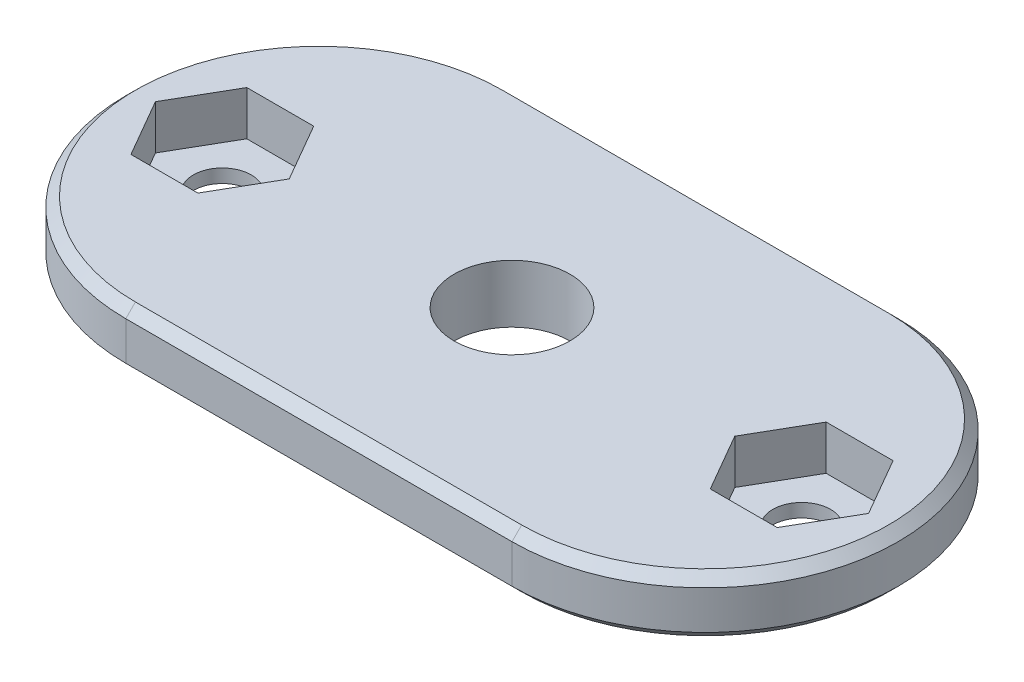
ISO-10303-21;
HEADER;
FILE_DESCRIPTION(('STEP AP214'),'2;1');
FILE_NAME('part.step','',(''),(''),'','','');
FILE_SCHEMA(('AUTOMOTIVE_DESIGN { 1 0 10303 214 1 1 1 1 }'));
ENDSEC;
DATA;
#1=APPLICATION_CONTEXT('core data for automotive mechanical design processes');
#2=APPLICATION_PROTOCOL_DEFINITION('international standard','automotive_design',2000,#1);
#3=PRODUCT_CONTEXT('',#1,'mechanical');
#4=PRODUCT('Part','Part','',(#3));
#5=PRODUCT_RELATED_PRODUCT_CATEGORY('part','',(#4));
#6=PRODUCT_DEFINITION_FORMATION('','',#4);
#7=PRODUCT_DEFINITION_CONTEXT('part definition',#1,'design');
#8=PRODUCT_DEFINITION('design','',#6,#7);
#9=PRODUCT_DEFINITION_SHAPE('','',#8);
#10=(LENGTH_UNIT() NAMED_UNIT(*) SI_UNIT(.MILLI.,.METRE.));
#11=(NAMED_UNIT(*) PLANE_ANGLE_UNIT() SI_UNIT($,.RADIAN.));
#12=(NAMED_UNIT(*) SI_UNIT($,.STERADIAN.) SOLID_ANGLE_UNIT());
#13=UNCERTAINTY_MEASURE_WITH_UNIT(LENGTH_MEASURE(1.E-05),#10,'distance_accuracy_value','');
#14=(GEOMETRIC_REPRESENTATION_CONTEXT(3) GLOBAL_UNCERTAINTY_ASSIGNED_CONTEXT((#13)) GLOBAL_UNIT_ASSIGNED_CONTEXT((#10,
#11,#12)) REPRESENTATION_CONTEXT('',''));
#15=CARTESIAN_POINT('',(0.,0.,0.));
#16=DIRECTION('',(0.,0.,1.));
#17=DIRECTION('',(1.,0.,0.));
#18=AXIS2_PLACEMENT_3D('',#15,#16,#17);
#19=CARTESIAN_POINT('',(25.,3.,0.));
#20=DIRECTION('',(0.,1.,0.));
#21=DIRECTION('',(0.,0.,1.));
#22=AXIS2_PLACEMENT_3D('',#19,#20,#21);
#23=CYLINDRICAL_SURFACE('',#22,1.49999999999999);
#24=CARTESIAN_POINT('',(25.,0.,0.));
#25=DIRECTION('',(0.,1.,0.));
#26=DIRECTION('',(0.,0.,1.));
#27=AXIS2_PLACEMENT_3D('',#24,#25,#26);
#28=CIRCLE('',#27,1.49999999999999);
#29=CARTESIAN_POINT('',(25.,0.,1.49999999999999));
#30=VERTEX_POINT('',#29);
#31=EDGE_CURVE('E287',#30,#30,#28,.T.);
#32=ORIENTED_EDGE('',*,*,#31,.F.);
#33=EDGE_LOOP('',(#32));
#34=FACE_BOUND('',#33,.T.);
#35=CARTESIAN_POINT('',(25.,0.7,0.));
#36=DIRECTION('',(0.,1.,0.));
#37=DIRECTION('',(0.,0.,1.));
#38=AXIS2_PLACEMENT_3D('',#35,#36,#37);
#39=CIRCLE('',#38,1.49999999999999);
#40=CARTESIAN_POINT('',(25.,0.7,1.49999999999999));
#41=VERTEX_POINT('',#40);
#42=EDGE_CURVE('E40',#41,#41,#39,.F.);
#43=ORIENTED_EDGE('',*,*,#42,.F.);
#44=EDGE_LOOP('',(#43));
#45=FACE_BOUND('',#44,.T.);
#46=ADVANCED_FACE('F35',(#34,#45),#23,.F.);
#47=CARTESIAN_POINT('',(-5.,3.,0.));
#48=DIRECTION('',(0.,1.,0.));
#49=DIRECTION('',(0.,0.,1.));
#50=AXIS2_PLACEMENT_3D('',#47,#48,#49);
#51=CYLINDRICAL_SURFACE('',#50,1.49999999999999);
#52=CARTESIAN_POINT('',(-5.,0.,0.));
#53=DIRECTION('',(0.,1.,0.));
#54=DIRECTION('',(0.,0.,1.));
#55=AXIS2_PLACEMENT_3D('',#52,#53,#54);
#56=CIRCLE('',#55,1.49999999999999);
#57=CARTESIAN_POINT('',(-5.,0.,1.49999999999999));
#58=VERTEX_POINT('',#57);
#59=EDGE_CURVE('E284',#58,#58,#56,.T.);
#60=ORIENTED_EDGE('',*,*,#59,.F.);
#61=EDGE_LOOP('',(#60));
#62=FACE_BOUND('',#61,.T.);
#63=CARTESIAN_POINT('',(-5.,0.7,0.));
#64=DIRECTION('',(0.,1.,0.));
#65=DIRECTION('',(0.,0.,1.));
#66=AXIS2_PLACEMENT_3D('',#63,#64,#65);
#67=CIRCLE('',#66,1.49999999999999);
#68=CARTESIAN_POINT('',(-5.,0.7,1.49999999999999));
#69=VERTEX_POINT('',#68);
#70=EDGE_CURVE('E224',#69,#69,#67,.F.);
#71=ORIENTED_EDGE('',*,*,#70,.F.);
#72=EDGE_LOOP('',(#71));
#73=FACE_BOUND('',#72,.T.);
#74=ADVANCED_FACE('F360',(#62,#73),#51,.F.);
#75=CARTESIAN_POINT('',(0.,3.,0.));
#76=DIRECTION('',(0.,-1.,0.));
#77=DIRECTION('',(0.,0.,-1.));
#78=AXIS2_PLACEMENT_3D('',#75,#76,#77);
#79=CYLINDRICAL_SURFACE('',#78,10.);
#80=DIRECTION('',(0.,-1.,0.));
#81=VECTOR('',#80,1.);
#82=CARTESIAN_POINT('',(0.,3.,10.));
#83=LINE('',#82,#81);
#84=CARTESIAN_POINT('',(0.,2.5,10.));
#85=VERTEX_POINT('',#84);
#86=CARTESIAN_POINT('',(0.,0.499999999999994,10.));
#87=VERTEX_POINT('',#86);
#88=EDGE_CURVE('E300',#85,#87,#83,.T.);
#89=ORIENTED_EDGE('',*,*,#88,.F.);
#90=CARTESIAN_POINT('',(0.,2.5,0.));
#91=DIRECTION('',(0.,1.,0.));
#92=DIRECTION('',(0.,0.,1.));
#93=AXIS2_PLACEMENT_3D('',#90,#91,#92);
#94=CIRCLE('',#93,10.);
#95=CARTESIAN_POINT('',(0.,2.5,-10.));
#96=VERTEX_POINT('',#95);
#97=EDGE_CURVE('E328',#85,#96,#94,.F.);
#98=ORIENTED_EDGE('',*,*,#97,.T.);
#99=DIRECTION('',(0.,-1.,0.));
#100=VECTOR('',#99,1.);
#101=CARTESIAN_POINT('',(0.,3.,-10.));
#102=LINE('',#101,#100);
#103=CARTESIAN_POINT('',(0.,0.499999999999994,-10.));
#104=VERTEX_POINT('',#103);
#105=EDGE_CURVE('E291',#96,#104,#102,.T.);
#106=ORIENTED_EDGE('',*,*,#105,.T.);
#107=CARTESIAN_POINT('',(0.,0.499999999999994,0.));
#108=DIRECTION('',(0.,1.,0.));
#109=DIRECTION('',(0.,0.,1.));
#110=AXIS2_PLACEMENT_3D('',#107,#108,#109);
#111=CIRCLE('',#110,10.);
#112=EDGE_CURVE('E326',#104,#87,#111,.T.);
#113=ORIENTED_EDGE('',*,*,#112,.T.);
#114=EDGE_LOOP('',(#89,#98,#106,#113));
#115=FACE_BOUND('',#114,.T.);
#116=ADVANCED_FACE('F366',(#115),#79,.T.);
#117=CARTESIAN_POINT('',(0.,3.,10.));
#118=DIRECTION('',(0.,0.,-1.));
#119=DIRECTION('',(-1.,0.,0.));
#120=AXIS2_PLACEMENT_3D('',#117,#118,#119);
#121=PLANE('',#120);
#122=DIRECTION('',(0.,-1.,0.));
#123=VECTOR('',#122,1.);
#124=CARTESIAN_POINT('',(20.,3.,10.));
#125=LINE('',#124,#123);
#126=CARTESIAN_POINT('',(20.,2.5,10.));
#127=VERTEX_POINT('',#126);
#128=CARTESIAN_POINT('',(20.,0.499999999999994,10.));
#129=VERTEX_POINT('',#128);
#130=EDGE_CURVE('E297',#127,#129,#125,.T.);
#131=ORIENTED_EDGE('',*,*,#130,.F.);
#132=DIRECTION('',(-1.,0.,0.));
#133=VECTOR('',#132,1.);
#134=CARTESIAN_POINT('',(0.,2.5,10.));
#135=LINE('',#134,#133);
#136=EDGE_CURVE('E324',#127,#85,#135,.T.);
#137=ORIENTED_EDGE('',*,*,#136,.T.);
#138=ORIENTED_EDGE('',*,*,#88,.T.);
#139=DIRECTION('',(1.,0.,0.));
#140=VECTOR('',#139,1.);
#141=CARTESIAN_POINT('',(0.,0.499999999999994,10.));
#142=LINE('',#141,#140);
#143=EDGE_CURVE('E321',#87,#129,#142,.T.);
#144=ORIENTED_EDGE('',*,*,#143,.T.);
#145=EDGE_LOOP('',(#131,#137,#138,#144));
#146=FACE_BOUND('',#145,.T.);
#147=ADVANCED_FACE('F388',(#146),#121,.F.);
#148=CARTESIAN_POINT('',(20.,3.,0.));
#149=DIRECTION('',(0.,-1.,0.));
#150=DIRECTION('',(0.,0.,-1.));
#151=AXIS2_PLACEMENT_3D('',#148,#149,#150);
#152=CYLINDRICAL_SURFACE('',#151,10.);
#153=DIRECTION('',(0.,-1.,0.));
#154=VECTOR('',#153,1.);
#155=CARTESIAN_POINT('',(20.,3.,-10.));
#156=LINE('',#155,#154);
#157=CARTESIAN_POINT('',(20.,2.5,-10.));
#158=VERTEX_POINT('',#157);
#159=CARTESIAN_POINT('',(20.,0.499999999999994,-10.));
#160=VERTEX_POINT('',#159);
#161=EDGE_CURVE('E294',#158,#160,#156,.T.);
#162=ORIENTED_EDGE('',*,*,#161,.F.);
#163=CARTESIAN_POINT('',(20.,2.5,0.));
#164=DIRECTION('',(0.,1.,0.));
#165=DIRECTION('',(0.,0.,1.));
#166=AXIS2_PLACEMENT_3D('',#163,#164,#165);
#167=CIRCLE('',#166,10.);
#168=EDGE_CURVE('E319',#158,#127,#167,.F.);
#169=ORIENTED_EDGE('',*,*,#168,.T.);
#170=ORIENTED_EDGE('',*,*,#130,.T.);
#171=CARTESIAN_POINT('',(20.,0.499999999999994,0.));
#172=DIRECTION('',(0.,1.,0.));
#173=DIRECTION('',(0.,0.,1.));
#174=AXIS2_PLACEMENT_3D('',#171,#172,#173);
#175=CIRCLE('',#174,10.);
#176=EDGE_CURVE('E317',#129,#160,#175,.T.);
#177=ORIENTED_EDGE('',*,*,#176,.T.);
#178=EDGE_LOOP('',(#162,#169,#170,#177));
#179=FACE_BOUND('',#178,.T.);
#180=ADVANCED_FACE('F384',(#179),#152,.T.);
#181=CARTESIAN_POINT('',(0.,3.,-10.));
#182=DIRECTION('',(0.,0.,1.));
#183=DIRECTION('',(1.,0.,0.));
#184=AXIS2_PLACEMENT_3D('',#181,#182,#183);
#185=PLANE('',#184);
#186=ORIENTED_EDGE('',*,*,#105,.F.);
#187=DIRECTION('',(1.,0.,0.));
#188=VECTOR('',#187,1.);
#189=CARTESIAN_POINT('',(20.,2.5,-10.));
#190=LINE('',#189,#188);
#191=EDGE_CURVE('E314',#96,#158,#190,.T.);
#192=ORIENTED_EDGE('',*,*,#191,.T.);
#193=ORIENTED_EDGE('',*,*,#161,.T.);
#194=DIRECTION('',(-1.,0.,0.));
#195=VECTOR('',#194,1.);
#196=CARTESIAN_POINT('',(0.,0.499999999999994,-10.));
#197=LINE('',#196,#195);
#198=EDGE_CURVE('E312',#160,#104,#197,.T.);
#199=ORIENTED_EDGE('',*,*,#198,.T.);
#200=EDGE_LOOP('',(#186,#192,#193,#199));
#201=FACE_BOUND('',#200,.T.);
#202=ADVANCED_FACE('F376',(#201),#185,.F.);
#203=CARTESIAN_POINT('',(0.,3.,0.));
#204=DIRECTION('',(0.,1.,0.));
#205=DIRECTION('',(0.,0.,1.));
#206=AXIS2_PLACEMENT_3D('',#203,#204,#205);
#207=PLANE('',#206);
#208=DIRECTION('',(0.5,0.,-0.866025403784439));
#209=VECTOR('',#208,1.);
#210=CARTESIAN_POINT('',(-3.26794919243112,3.,3.));
#211=LINE('',#210,#209);
#212=CARTESIAN_POINT('',(-3.26794919243112,3.,3.));
#213=VERTEX_POINT('',#212);
#214=CARTESIAN_POINT('',(-1.53589838486225,3.,0.));
#215=VERTEX_POINT('',#214);
#216=EDGE_CURVE('E53',#213,#215,#211,.T.);
#217=ORIENTED_EDGE('',*,*,#216,.F.);
#218=DIRECTION('',(1.,0.,0.));
#219=VECTOR('',#218,1.);
#220=CARTESIAN_POINT('',(-6.73205080756888,3.,3.));
#221=LINE('',#220,#219);
#222=CARTESIAN_POINT('',(-6.73205080756888,3.,3.));
#223=VERTEX_POINT('',#222);
#224=EDGE_CURVE('E197',#223,#213,#221,.T.);
#225=ORIENTED_EDGE('',*,*,#224,.F.);
#226=DIRECTION('',(0.5,0.,0.866025403784438));
#227=VECTOR('',#226,1.);
#228=CARTESIAN_POINT('',(-8.46410161513776,3.,0.));
#229=LINE('',#228,#227);
#230=CARTESIAN_POINT('',(-8.46410161513776,3.,0.));
#231=VERTEX_POINT('',#230);
#232=EDGE_CURVE('E200',#231,#223,#229,.T.);
#233=ORIENTED_EDGE('',*,*,#232,.F.);
#234=DIRECTION('',(-0.5,0.,0.866025403784439));
#235=VECTOR('',#234,1.);
#236=CARTESIAN_POINT('',(-6.73205080756888,3.,-3.));
#237=LINE('',#236,#235);
#238=CARTESIAN_POINT('',(-6.73205080756888,3.,-3.));
#239=VERTEX_POINT('',#238);
#240=EDGE_CURVE('E217',#239,#231,#237,.T.);
#241=ORIENTED_EDGE('',*,*,#240,.F.);
#242=DIRECTION('',(-1.,0.,0.));
#243=VECTOR('',#242,1.);
#244=CARTESIAN_POINT('',(-3.26794919243112,3.,-3.));
#245=LINE('',#244,#243);
#246=CARTESIAN_POINT('',(-3.26794919243112,3.,-3.));
#247=VERTEX_POINT('',#246);
#248=EDGE_CURVE('E214',#247,#239,#245,.T.);
#249=ORIENTED_EDGE('',*,*,#248,.F.);
#250=DIRECTION('',(-0.5,0.,-0.866025403784439));
#251=VECTOR('',#250,1.);
#252=CARTESIAN_POINT('',(-1.53589838486225,3.,0.));
#253=LINE('',#252,#251);
#254=EDGE_CURVE('E211',#215,#247,#253,.T.);
#255=ORIENTED_EDGE('',*,*,#254,.F.);
#256=EDGE_LOOP('',(#217,#225,#233,#241,#249,#255));
#257=FACE_BOUND('',#256,.T.);
#258=DIRECTION('',(-0.5,0.,0.866025403784438));
#259=VECTOR('',#258,1.);
#260=CARTESIAN_POINT('',(23.2679491924311,3.,-2.99999999999999));
#261=LINE('',#260,#259);
#262=CARTESIAN_POINT('',(23.2679491924311,3.,-2.99999999999999));
#263=VERTEX_POINT('',#262);
#264=CARTESIAN_POINT('',(21.5358983848623,3.,0.));
#265=VERTEX_POINT('',#264);
#266=EDGE_CURVE('E61',#263,#265,#261,.T.);
#267=ORIENTED_EDGE('',*,*,#266,.F.);
#268=DIRECTION('',(-1.,0.,0.));
#269=VECTOR('',#268,1.);
#270=CARTESIAN_POINT('',(26.7320508075689,3.,-2.99999999999999));
#271=LINE('',#270,#269);
#272=CARTESIAN_POINT('',(26.7320508075689,3.,-2.99999999999999));
#273=VERTEX_POINT('',#272);
#274=EDGE_CURVE('E236',#273,#263,#271,.T.);
#275=ORIENTED_EDGE('',*,*,#274,.F.);
#276=DIRECTION('',(-0.5,0.,-0.866025403784439));
#277=VECTOR('',#276,1.);
#278=CARTESIAN_POINT('',(28.4641016151378,3.,0.));
#279=LINE('',#278,#277);
#280=CARTESIAN_POINT('',(28.4641016151378,3.,0.));
#281=VERTEX_POINT('',#280);
#282=EDGE_CURVE('E262',#281,#273,#279,.T.);
#283=ORIENTED_EDGE('',*,*,#282,.F.);
#284=DIRECTION('',(0.5,0.,-0.866025403784438));
#285=VECTOR('',#284,1.);
#286=CARTESIAN_POINT('',(26.7320508075689,3.,3.));
#287=LINE('',#286,#285);
#288=CARTESIAN_POINT('',(26.7320508075689,3.,3.));
#289=VERTEX_POINT('',#288);
#290=EDGE_CURVE('E259',#289,#281,#287,.T.);
#291=ORIENTED_EDGE('',*,*,#290,.F.);
#292=DIRECTION('',(1.,0.,0.));
#293=VECTOR('',#292,1.);
#294=CARTESIAN_POINT('',(23.2679491924311,3.,3.));
#295=LINE('',#294,#293);
#296=CARTESIAN_POINT('',(23.2679491924311,3.,3.));
#297=VERTEX_POINT('',#296);
#298=EDGE_CURVE('E256',#297,#289,#295,.T.);
#299=ORIENTED_EDGE('',*,*,#298,.F.);
#300=DIRECTION('',(0.5,0.,0.866025403784439));
#301=VECTOR('',#300,1.);
#302=CARTESIAN_POINT('',(21.5358983848623,3.,0.));
#303=LINE('',#302,#301);
#304=EDGE_CURVE('E253',#265,#297,#303,.T.);
#305=ORIENTED_EDGE('',*,*,#304,.F.);
#306=EDGE_LOOP('',(#267,#275,#283,#291,#299,#305));
#307=FACE_BOUND('',#306,.T.);
#308=CARTESIAN_POINT('',(10.,3.,0.));
#309=DIRECTION('',(0.,1.,0.));
#310=DIRECTION('',(0.,0.,1.));
#311=AXIS2_PLACEMENT_3D('',#308,#309,#310);
#312=CIRCLE('',#311,3.);
#313=CARTESIAN_POINT('',(10.,3.,3.));
#314=VERTEX_POINT('',#313);
#315=EDGE_CURVE('E281',#314,#314,#312,.T.);
#316=ORIENTED_EDGE('',*,*,#315,.F.);
#317=EDGE_LOOP('',(#316));
#318=FACE_BOUND('',#317,.T.);
#319=CARTESIAN_POINT('',(20.,3.,0.));
#320=DIRECTION('',(0.,1.,0.));
#321=DIRECTION('',(0.,0.,1.));
#322=AXIS2_PLACEMENT_3D('',#319,#320,#321);
#323=CIRCLE('',#322,9.50000000000001);
#324=CARTESIAN_POINT('',(20.,3.,9.50000000000001));
#325=VERTEX_POINT('',#324);
#326=CARTESIAN_POINT('',(20.,3.,-9.50000000000001));
#327=VERTEX_POINT('',#326);
#328=EDGE_CURVE('E307',#325,#327,#323,.T.);
#329=ORIENTED_EDGE('',*,*,#328,.T.);
#330=DIRECTION('',(-1.,0.,0.));
#331=VECTOR('',#330,1.);
#332=CARTESIAN_POINT('',(0.,3.,-9.50000000000001));
#333=LINE('',#332,#331);
#334=CARTESIAN_POINT('',(0.,3.,-9.50000000000001));
#335=VERTEX_POINT('',#334);
#336=EDGE_CURVE('E309',#327,#335,#333,.T.);
#337=ORIENTED_EDGE('',*,*,#336,.T.);
#338=CARTESIAN_POINT('',(0.,3.,0.));
#339=DIRECTION('',(0.,1.,0.));
#340=DIRECTION('',(0.,0.,1.));
#341=AXIS2_PLACEMENT_3D('',#338,#339,#340);
#342=CIRCLE('',#341,9.50000000000001);
#343=CARTESIAN_POINT('',(0.,3.,9.50000000000001));
#344=VERTEX_POINT('',#343);
#345=EDGE_CURVE('E303',#335,#344,#342,.T.);
#346=ORIENTED_EDGE('',*,*,#345,.T.);
#347=DIRECTION('',(1.,0.,0.));
#348=VECTOR('',#347,1.);
#349=CARTESIAN_POINT('',(20.,3.,9.50000000000001));
#350=LINE('',#349,#348);
#351=EDGE_CURVE('E305',#344,#325,#350,.T.);
#352=ORIENTED_EDGE('',*,*,#351,.T.);
#353=EDGE_LOOP('',(#329,#337,#346,#352));
#354=FACE_BOUND('',#353,.T.);
#355=ADVANCED_FACE('F372',(#257,#307,#318,#354),#207,.T.);
#356=CARTESIAN_POINT('',(0.,0.,0.));
#357=DIRECTION('',(0.,1.,0.));
#358=DIRECTION('',(0.,0.,1.));
#359=AXIS2_PLACEMENT_3D('',#356,#357,#358);
#360=PLANE('',#359);
#361=CARTESIAN_POINT('',(10.,0.,0.));
#362=DIRECTION('',(0.,1.,0.));
#363=DIRECTION('',(0.,0.,1.));
#364=AXIS2_PLACEMENT_3D('',#361,#362,#363);
#365=CIRCLE('',#364,3.);
#366=CARTESIAN_POINT('',(10.,0.,3.));
#367=VERTEX_POINT('',#366);
#368=EDGE_CURVE('E277',#367,#367,#365,.T.);
#369=ORIENTED_EDGE('',*,*,#368,.T.);
#370=EDGE_LOOP('',(#369));
#371=FACE_BOUND('',#370,.T.);
#372=CARTESIAN_POINT('',(20.,0.,0.));
#373=DIRECTION('',(0.,1.,0.));
#374=DIRECTION('',(0.,0.,1.));
#375=AXIS2_PLACEMENT_3D('',#372,#373,#374);
#376=CIRCLE('',#375,9.50000000000001);
#377=CARTESIAN_POINT('',(20.,0.,-9.50000000000001));
#378=VERTEX_POINT('',#377);
#379=CARTESIAN_POINT('',(20.,0.,9.50000000000001));
#380=VERTEX_POINT('',#379);
#381=EDGE_CURVE('E45',#378,#380,#376,.F.);
#382=ORIENTED_EDGE('',*,*,#381,.T.);
#383=DIRECTION('',(-1.,0.,0.));
#384=VECTOR('',#383,1.);
#385=CARTESIAN_POINT('',(0.,0.,9.50000000000001));
#386=LINE('',#385,#384);
#387=CARTESIAN_POINT('',(0.,0.,9.50000000000001));
#388=VERTEX_POINT('',#387);
#389=EDGE_CURVE('E11',#380,#388,#386,.T.);
#390=ORIENTED_EDGE('',*,*,#389,.T.);
#391=CARTESIAN_POINT('',(0.,0.,0.));
#392=DIRECTION('',(0.,1.,0.));
#393=DIRECTION('',(0.,0.,1.));
#394=AXIS2_PLACEMENT_3D('',#391,#392,#393);
#395=CIRCLE('',#394,9.50000000000001);
#396=CARTESIAN_POINT('',(0.,0.,-9.50000000000001));
#397=VERTEX_POINT('',#396);
#398=EDGE_CURVE('E332',#388,#397,#395,.F.);
#399=ORIENTED_EDGE('',*,*,#398,.T.);
#400=DIRECTION('',(1.,0.,0.));
#401=VECTOR('',#400,1.);
#402=CARTESIAN_POINT('',(0.,0.,-9.50000000000001));
#403=LINE('',#402,#401);
#404=EDGE_CURVE('E330',#397,#378,#403,.T.);
#405=ORIENTED_EDGE('',*,*,#404,.T.);
#406=EDGE_LOOP('',(#382,#390,#399,#405));
#407=FACE_BOUND('',#406,.T.);
#408=ORIENTED_EDGE('',*,*,#59,.T.);
#409=EDGE_LOOP('',(#408));
#410=FACE_BOUND('',#409,.T.);
#411=ORIENTED_EDGE('',*,*,#31,.T.);
#412=EDGE_LOOP('',(#411));
#413=FACE_BOUND('',#412,.T.);
#414=ADVANCED_FACE('F375',(#371,#407,#410,#413),#360,.F.);
#415=CARTESIAN_POINT('',(0.,3.,9.50000000000001));
#416=DIRECTION('',(0.,0.707106781186542,0.707106781186552));
#417=DIRECTION('',(-1.,0.,0.));
#418=AXIS2_PLACEMENT_3D('',#415,#416,#417);
#419=PLANE('',#418);
#420=DIRECTION('',(0.,0.707106781186552,-0.707106781186542));
#421=VECTOR('',#420,1.);
#422=CARTESIAN_POINT('',(0.,2.5,10.));
#423=LINE('',#422,#421);
#424=EDGE_CURVE('E340',#85,#344,#423,.T.);
#425=ORIENTED_EDGE('',*,*,#424,.F.);
#426=ORIENTED_EDGE('',*,*,#136,.F.);
#427=DIRECTION('',(0.,-0.707106781186552,0.707106781186542));
#428=VECTOR('',#427,1.);
#429=CARTESIAN_POINT('',(20.,3.,9.50000000000001));
#430=LINE('',#429,#428);
#431=EDGE_CURVE('E288',#325,#127,#430,.T.);
#432=ORIENTED_EDGE('',*,*,#431,.F.);
#433=ORIENTED_EDGE('',*,*,#351,.F.);
#434=EDGE_LOOP('',(#425,#426,#432,#433));
#435=FACE_BOUND('',#434,.T.);
#436=ADVANCED_FACE('F380',(#435),#419,.T.);
#437=CARTESIAN_POINT('',(20.,3.,0.));
#438=DIRECTION('',(0.,-1.,0.));
#439=DIRECTION('',(0.,0.,-1.));
#440=AXIS2_PLACEMENT_3D('',#437,#438,#439);
#441=CONICAL_SURFACE('',#440,9.50000000000001,0.785398163397441);
#442=ORIENTED_EDGE('',*,*,#431,.T.);
#443=ORIENTED_EDGE('',*,*,#168,.F.);
#444=DIRECTION('',(0.,-0.707106781186552,-0.707106781186542));
#445=VECTOR('',#444,1.);
#446=CARTESIAN_POINT('',(20.,3.,-9.50000000000001));
#447=LINE('',#446,#445);
#448=EDGE_CURVE('E337',#327,#158,#447,.T.);
#449=ORIENTED_EDGE('',*,*,#448,.F.);
#450=ORIENTED_EDGE('',*,*,#328,.F.);
#451=EDGE_LOOP('',(#442,#443,#449,#450));
#452=FACE_BOUND('',#451,.T.);
#453=ADVANCED_FACE('F410',(#452),#441,.T.);
#454=CARTESIAN_POINT('',(0.,3.,0.));
#455=DIRECTION('',(0.,-1.,0.));
#456=DIRECTION('',(0.,0.,-1.));
#457=AXIS2_PLACEMENT_3D('',#454,#455,#456);
#458=CONICAL_SURFACE('',#457,9.50000000000001,0.785398163397441);
#459=ORIENTED_EDGE('',*,*,#424,.T.);
#460=ORIENTED_EDGE('',*,*,#345,.F.);
#461=DIRECTION('',(0.,0.707106781186552,0.707106781186542));
#462=VECTOR('',#461,1.);
#463=CARTESIAN_POINT('',(0.,2.5,-10.));
#464=LINE('',#463,#462);
#465=EDGE_CURVE('E335',#96,#335,#464,.T.);
#466=ORIENTED_EDGE('',*,*,#465,.F.);
#467=ORIENTED_EDGE('',*,*,#97,.F.);
#468=EDGE_LOOP('',(#459,#460,#466,#467));
#469=FACE_BOUND('',#468,.T.);
#470=ADVANCED_FACE('F403',(#469),#458,.T.);
#471=CARTESIAN_POINT('',(0.,3.,-9.50000000000001));
#472=DIRECTION('',(0.,0.707106781186542,-0.707106781186552));
#473=DIRECTION('',(1.,0.,0.));
#474=AXIS2_PLACEMENT_3D('',#471,#472,#473);
#475=PLANE('',#474);
#476=ORIENTED_EDGE('',*,*,#448,.T.);
#477=ORIENTED_EDGE('',*,*,#191,.F.);
#478=ORIENTED_EDGE('',*,*,#465,.T.);
#479=ORIENTED_EDGE('',*,*,#336,.F.);
#480=EDGE_LOOP('',(#476,#477,#478,#479));
#481=FACE_BOUND('',#480,.T.);
#482=ADVANCED_FACE('F397',(#481),#475,.T.);
#483=CARTESIAN_POINT('',(0.,0.499999999999994,-10.));
#484=DIRECTION('',(0.,0.707106781186547,0.707106781186547));
#485=DIRECTION('',(-1.,0.,0.));
#486=AXIS2_PLACEMENT_3D('',#483,#484,#485);
#487=PLANE('',#486);
#488=DIRECTION('',(0.,0.707106781186547,-0.707106781186547));
#489=VECTOR('',#488,1.);
#490=CARTESIAN_POINT('',(20.,0.,-9.50000000000001));
#491=LINE('',#490,#489);
#492=EDGE_CURVE('E348',#378,#160,#491,.T.);
#493=ORIENTED_EDGE('',*,*,#492,.F.);
#494=ORIENTED_EDGE('',*,*,#404,.F.);
#495=DIRECTION('',(0.,-0.707106781186547,0.707106781186547));
#496=VECTOR('',#495,1.);
#497=CARTESIAN_POINT('',(0.,0.499999999999994,-10.));
#498=LINE('',#497,#496);
#499=EDGE_CURVE('E338',#104,#397,#498,.T.);
#500=ORIENTED_EDGE('',*,*,#499,.F.);
#501=ORIENTED_EDGE('',*,*,#198,.F.);
#502=EDGE_LOOP('',(#493,#494,#500,#501));
#503=FACE_BOUND('',#502,.T.);
#504=ADVANCED_FACE('F38',(#503),#487,.F.);
#505=CARTESIAN_POINT('',(0.,0.499999999999994,0.));
#506=DIRECTION('',(0.,1.,0.));
#507=DIRECTION('',(0.,0.,1.));
#508=AXIS2_PLACEMENT_3D('',#505,#506,#507);
#509=CONICAL_SURFACE('',#508,10.,0.785398163397448);
#510=ORIENTED_EDGE('',*,*,#499,.T.);
#511=ORIENTED_EDGE('',*,*,#398,.F.);
#512=DIRECTION('',(0.,-0.707106781186547,-0.707106781186547));
#513=VECTOR('',#512,1.);
#514=CARTESIAN_POINT('',(0.,0.499999999999994,10.));
#515=LINE('',#514,#513);
#516=EDGE_CURVE('E346',#87,#388,#515,.T.);
#517=ORIENTED_EDGE('',*,*,#516,.F.);
#518=ORIENTED_EDGE('',*,*,#112,.F.);
#519=EDGE_LOOP('',(#510,#511,#517,#518));
#520=FACE_BOUND('',#519,.T.);
#521=ADVANCED_FACE('F437',(#520),#509,.T.);
#522=CARTESIAN_POINT('',(20.,0.499999999999994,0.));
#523=DIRECTION('',(0.,1.,0.));
#524=DIRECTION('',(0.,0.,1.));
#525=AXIS2_PLACEMENT_3D('',#522,#523,#524);
#526=CONICAL_SURFACE('',#525,10.,0.785398163397448);
#527=ORIENTED_EDGE('',*,*,#492,.T.);
#528=ORIENTED_EDGE('',*,*,#176,.F.);
#529=DIRECTION('',(0.,0.707106781186547,0.707106781186547));
#530=VECTOR('',#529,1.);
#531=CARTESIAN_POINT('',(20.,0.,9.50000000000001));
#532=LINE('',#531,#530);
#533=EDGE_CURVE('E280',#380,#129,#532,.T.);
#534=ORIENTED_EDGE('',*,*,#533,.F.);
#535=ORIENTED_EDGE('',*,*,#381,.F.);
#536=EDGE_LOOP('',(#527,#528,#534,#535));
#537=FACE_BOUND('',#536,.T.);
#538=ADVANCED_FACE('F431',(#537),#526,.T.);
#539=CARTESIAN_POINT('',(0.,0.499999999999994,10.));
#540=DIRECTION('',(0.,0.707106781186547,-0.707106781186547));
#541=DIRECTION('',(1.,0.,0.));
#542=AXIS2_PLACEMENT_3D('',#539,#540,#541);
#543=PLANE('',#542);
#544=ORIENTED_EDGE('',*,*,#516,.T.);
#545=ORIENTED_EDGE('',*,*,#389,.F.);
#546=ORIENTED_EDGE('',*,*,#533,.T.);
#547=ORIENTED_EDGE('',*,*,#143,.F.);
#548=EDGE_LOOP('',(#544,#545,#546,#547));
#549=FACE_BOUND('',#548,.T.);
#550=ADVANCED_FACE('F424',(#549),#543,.F.);
#551=CARTESIAN_POINT('',(10.,0.,0.));
#552=DIRECTION('',(0.,1.,0.));
#553=DIRECTION('',(0.,0.,1.));
#554=AXIS2_PLACEMENT_3D('',#551,#552,#553);
#555=CYLINDRICAL_SURFACE('',#554,3.);
#556=ORIENTED_EDGE('',*,*,#368,.F.);
#557=EDGE_LOOP('',(#556));
#558=FACE_BOUND('',#557,.T.);
#559=ORIENTED_EDGE('',*,*,#315,.T.);
#560=EDGE_LOOP('',(#559));
#561=FACE_BOUND('',#560,.T.);
#562=ADVANCED_FACE('F430',(#558,#561),#555,.F.);
#563=CARTESIAN_POINT('',(0.,0.7,0.));
#564=DIRECTION('',(0.,1.,0.));
#565=DIRECTION('',(0.,0.,1.));
#566=AXIS2_PLACEMENT_3D('',#563,#564,#565);
#567=PLANE('',#566);
#568=DIRECTION('',(0.5,0.,-0.866025403784439));
#569=VECTOR('',#568,1.);
#570=CARTESIAN_POINT('',(-3.26794919243112,0.7,3.));
#571=LINE('',#570,#569);
#572=CARTESIAN_POINT('',(-3.26794919243112,0.7,3.));
#573=VERTEX_POINT('',#572);
#574=CARTESIAN_POINT('',(-1.53589838486225,0.7,0.));
#575=VERTEX_POINT('',#574);
#576=EDGE_CURVE('E177',#573,#575,#571,.T.);
#577=ORIENTED_EDGE('',*,*,#576,.T.);
#578=DIRECTION('',(-0.5,0.,-0.866025403784439));
#579=VECTOR('',#578,1.);
#580=CARTESIAN_POINT('',(-1.53589838486225,0.7,0.));
#581=LINE('',#580,#579);
#582=CARTESIAN_POINT('',(-3.26794919243112,0.7,-3.));
#583=VERTEX_POINT('',#582);
#584=EDGE_CURVE('E186',#575,#583,#581,.T.);
#585=ORIENTED_EDGE('',*,*,#584,.T.);
#586=DIRECTION('',(-1.,0.,0.));
#587=VECTOR('',#586,1.);
#588=CARTESIAN_POINT('',(-3.26794919243112,0.7,-3.));
#589=LINE('',#588,#587);
#590=CARTESIAN_POINT('',(-6.73205080756888,0.7,-3.));
#591=VERTEX_POINT('',#590);
#592=EDGE_CURVE('E191',#583,#591,#589,.T.);
#593=ORIENTED_EDGE('',*,*,#592,.T.);
#594=DIRECTION('',(-0.5,0.,0.866025403784439));
#595=VECTOR('',#594,1.);
#596=CARTESIAN_POINT('',(-6.73205080756888,0.7,-3.));
#597=LINE('',#596,#595);
#598=CARTESIAN_POINT('',(-8.46410161513776,0.7,0.));
#599=VERTEX_POINT('',#598);
#600=EDGE_CURVE('E204',#591,#599,#597,.T.);
#601=ORIENTED_EDGE('',*,*,#600,.T.);
#602=DIRECTION('',(0.5,0.,0.866025403784438));
#603=VECTOR('',#602,1.);
#604=CARTESIAN_POINT('',(-8.46410161513776,0.7,0.));
#605=LINE('',#604,#603);
#606=CARTESIAN_POINT('',(-6.73205080756888,0.7,3.));
#607=VERTEX_POINT('',#606);
#608=EDGE_CURVE('E207',#599,#607,#605,.T.);
#609=ORIENTED_EDGE('',*,*,#608,.T.);
#610=DIRECTION('',(1.,0.,0.));
#611=VECTOR('',#610,1.);
#612=CARTESIAN_POINT('',(-6.73205080756888,0.7,3.));
#613=LINE('',#612,#611);
#614=EDGE_CURVE('E183',#607,#573,#613,.T.);
#615=ORIENTED_EDGE('',*,*,#614,.T.);
#616=EDGE_LOOP('',(#577,#585,#593,#601,#609,#615));
#617=FACE_BOUND('',#616,.T.);
#618=ORIENTED_EDGE('',*,*,#70,.T.);
#619=EDGE_LOOP('',(#618));
#620=FACE_BOUND('',#619,.T.);
#621=ADVANCED_FACE('F193',(#617,#620),#567,.T.);
#622=CARTESIAN_POINT('',(-3.26794919243112,0.7,3.));
#623=DIRECTION('',(0.866025403784439,0.,0.5));
#624=DIRECTION('',(0.5,0.,-0.866025403784439));
#625=AXIS2_PLACEMENT_3D('',#622,#623,#624);
#626=PLANE('',#625);
#627=ORIENTED_EDGE('',*,*,#216,.T.);
#628=DIRECTION('',(0.,1.,0.));
#629=VECTOR('',#628,1.);
#630=CARTESIAN_POINT('',(-1.53589838486225,0.7,0.));
#631=LINE('',#630,#629);
#632=EDGE_CURVE('E173',#575,#215,#631,.T.);
#633=ORIENTED_EDGE('',*,*,#632,.F.);
#634=ORIENTED_EDGE('',*,*,#576,.F.);
#635=DIRECTION('',(0.,1.,0.));
#636=VECTOR('',#635,1.);
#637=CARTESIAN_POINT('',(-3.26794919243112,0.7,3.));
#638=LINE('',#637,#636);
#639=EDGE_CURVE('E222',#573,#213,#638,.T.);
#640=ORIENTED_EDGE('',*,*,#639,.T.);
#641=EDGE_LOOP('',(#627,#633,#634,#640));
#642=FACE_BOUND('',#641,.T.);
#643=ADVANCED_FACE('F175',(#642),#626,.F.);
#644=CARTESIAN_POINT('',(-6.73205080756888,0.7,3.));
#645=DIRECTION('',(0.,0.,1.));
#646=DIRECTION('',(1.,0.,0.));
#647=AXIS2_PLACEMENT_3D('',#644,#645,#646);
#648=PLANE('',#647);
#649=ORIENTED_EDGE('',*,*,#224,.T.);
#650=ORIENTED_EDGE('',*,*,#639,.F.);
#651=ORIENTED_EDGE('',*,*,#614,.F.);
#652=DIRECTION('',(0.,1.,0.));
#653=VECTOR('',#652,1.);
#654=CARTESIAN_POINT('',(-6.73205080756888,0.7,3.));
#655=LINE('',#654,#653);
#656=EDGE_CURVE('E225',#607,#223,#655,.T.);
#657=ORIENTED_EDGE('',*,*,#656,.T.);
#658=EDGE_LOOP('',(#649,#650,#651,#657));
#659=FACE_BOUND('',#658,.T.);
#660=ADVANCED_FACE('F556',(#659),#648,.F.);
#661=CARTESIAN_POINT('',(-8.46410161513776,0.7,0.));
#662=DIRECTION('',(-0.866025403784438,0.,0.5));
#663=DIRECTION('',(0.5,0.,0.866025403784438));
#664=AXIS2_PLACEMENT_3D('',#661,#662,#663);
#665=PLANE('',#664);
#666=ORIENTED_EDGE('',*,*,#232,.T.);
#667=ORIENTED_EDGE('',*,*,#656,.F.);
#668=ORIENTED_EDGE('',*,*,#608,.F.);
#669=DIRECTION('',(0.,1.,0.));
#670=VECTOR('',#669,1.);
#671=CARTESIAN_POINT('',(-8.46410161513776,0.7,0.));
#672=LINE('',#671,#670);
#673=EDGE_CURVE('E227',#599,#231,#672,.T.);
#674=ORIENTED_EDGE('',*,*,#673,.T.);
#675=EDGE_LOOP('',(#666,#667,#668,#674));
#676=FACE_BOUND('',#675,.T.);
#677=ADVANCED_FACE('F563',(#676),#665,.F.);
#678=CARTESIAN_POINT('',(-6.73205080756888,0.7,-3.));
#679=DIRECTION('',(-0.866025403784439,0.,-0.5));
#680=DIRECTION('',(-0.5,0.,0.866025403784439));
#681=AXIS2_PLACEMENT_3D('',#678,#679,#680);
#682=PLANE('',#681);
#683=ORIENTED_EDGE('',*,*,#240,.T.);
#684=ORIENTED_EDGE('',*,*,#673,.F.);
#685=ORIENTED_EDGE('',*,*,#600,.F.);
#686=DIRECTION('',(0.,1.,0.));
#687=VECTOR('',#686,1.);
#688=CARTESIAN_POINT('',(-6.73205080756888,0.7,-3.));
#689=LINE('',#688,#687);
#690=EDGE_CURVE('E229',#591,#239,#689,.T.);
#691=ORIENTED_EDGE('',*,*,#690,.T.);
#692=EDGE_LOOP('',(#683,#684,#685,#691));
#693=FACE_BOUND('',#692,.T.);
#694=ADVANCED_FACE('F571',(#693),#682,.F.);
#695=CARTESIAN_POINT('',(-3.26794919243112,0.7,-3.));
#696=DIRECTION('',(0.,0.,-1.));
#697=DIRECTION('',(-1.,0.,0.));
#698=AXIS2_PLACEMENT_3D('',#695,#696,#697);
#699=PLANE('',#698);
#700=ORIENTED_EDGE('',*,*,#248,.T.);
#701=ORIENTED_EDGE('',*,*,#690,.F.);
#702=ORIENTED_EDGE('',*,*,#592,.F.);
#703=DIRECTION('',(0.,1.,0.));
#704=VECTOR('',#703,1.);
#705=CARTESIAN_POINT('',(-3.26794919243112,0.7,-3.));
#706=LINE('',#705,#704);
#707=EDGE_CURVE('E182',#583,#247,#706,.T.);
#708=ORIENTED_EDGE('',*,*,#707,.T.);
#709=EDGE_LOOP('',(#700,#701,#702,#708));
#710=FACE_BOUND('',#709,.T.);
#711=ADVANCED_FACE('F579',(#710),#699,.F.);
#712=CARTESIAN_POINT('',(-1.53589838486225,0.7,0.));
#713=DIRECTION('',(0.866025403784439,0.,-0.5));
#714=DIRECTION('',(-0.5,0.,-0.866025403784439));
#715=AXIS2_PLACEMENT_3D('',#712,#713,#714);
#716=PLANE('',#715);
#717=ORIENTED_EDGE('',*,*,#254,.T.);
#718=ORIENTED_EDGE('',*,*,#707,.F.);
#719=ORIENTED_EDGE('',*,*,#584,.F.);
#720=ORIENTED_EDGE('',*,*,#632,.T.);
#721=EDGE_LOOP('',(#717,#718,#719,#720));
#722=FACE_BOUND('',#721,.T.);
#723=ADVANCED_FACE('F187',(#722),#716,.F.);
#724=CARTESIAN_POINT('',(0.,0.7,0.));
#725=DIRECTION('',(0.,1.,0.));
#726=DIRECTION('',(0.,0.,1.));
#727=AXIS2_PLACEMENT_3D('',#724,#725,#726);
#728=PLANE('',#727);
#729=DIRECTION('',(-0.5,0.,0.866025403784438));
#730=VECTOR('',#729,1.);
#731=CARTESIAN_POINT('',(23.2679491924311,0.7,-2.99999999999999));
#732=LINE('',#731,#730);
#733=CARTESIAN_POINT('',(23.2679491924311,0.7,-2.99999999999999));
#734=VERTEX_POINT('',#733);
#735=CARTESIAN_POINT('',(21.5358983848623,0.7,0.));
#736=VERTEX_POINT('',#735);
#737=EDGE_CURVE('E232',#734,#736,#732,.T.);
#738=ORIENTED_EDGE('',*,*,#737,.T.);
#739=DIRECTION('',(0.5,0.,0.866025403784439));
#740=VECTOR('',#739,1.);
#741=CARTESIAN_POINT('',(21.5358983848623,0.7,0.));
#742=LINE('',#741,#740);
#743=CARTESIAN_POINT('',(23.2679491924311,0.7,3.));
#744=VERTEX_POINT('',#743);
#745=EDGE_CURVE('E235',#736,#744,#742,.T.);
#746=ORIENTED_EDGE('',*,*,#745,.T.);
#747=DIRECTION('',(1.,0.,0.));
#748=VECTOR('',#747,1.);
#749=CARTESIAN_POINT('',(23.2679491924311,0.7,3.));
#750=LINE('',#749,#748);
#751=CARTESIAN_POINT('',(26.7320508075689,0.7,3.));
#752=VERTEX_POINT('',#751);
#753=EDGE_CURVE('E239',#744,#752,#750,.T.);
#754=ORIENTED_EDGE('',*,*,#753,.T.);
#755=DIRECTION('',(0.5,0.,-0.866025403784438));
#756=VECTOR('',#755,1.);
#757=CARTESIAN_POINT('',(26.7320508075689,0.7,3.));
#758=LINE('',#757,#756);
#759=CARTESIAN_POINT('',(28.4641016151378,0.7,0.));
#760=VERTEX_POINT('',#759);
#761=EDGE_CURVE('E242',#752,#760,#758,.T.);
#762=ORIENTED_EDGE('',*,*,#761,.T.);
#763=DIRECTION('',(-0.5,0.,-0.866025403784439));
#764=VECTOR('',#763,1.);
#765=CARTESIAN_POINT('',(28.4641016151378,0.7,0.));
#766=LINE('',#765,#764);
#767=CARTESIAN_POINT('',(26.7320508075689,0.7,-2.99999999999999));
#768=VERTEX_POINT('',#767);
#769=EDGE_CURVE('E245',#760,#768,#766,.T.);
#770=ORIENTED_EDGE('',*,*,#769,.T.);
#771=DIRECTION('',(-1.,0.,0.));
#772=VECTOR('',#771,1.);
#773=CARTESIAN_POINT('',(26.7320508075689,0.7,-2.99999999999999));
#774=LINE('',#773,#772);
#775=EDGE_CURVE('E248',#768,#734,#774,.T.);
#776=ORIENTED_EDGE('',*,*,#775,.T.);
#777=EDGE_LOOP('',(#738,#746,#754,#762,#770,#776));
#778=FACE_BOUND('',#777,.T.);
#779=ORIENTED_EDGE('',*,*,#42,.T.);
#780=EDGE_LOOP('',(#779));
#781=FACE_BOUND('',#780,.T.);
#782=ADVANCED_FACE('F357',(#778,#781),#728,.T.);
#783=CARTESIAN_POINT('',(23.2679491924311,0.7,-2.99999999999999));
#784=DIRECTION('',(-0.866025403784439,0.,-0.5));
#785=DIRECTION('',(-0.5,0.,0.866025403784439));
#786=AXIS2_PLACEMENT_3D('',#783,#784,#785);
#787=PLANE('',#786);
#788=ORIENTED_EDGE('',*,*,#266,.T.);
#789=DIRECTION('',(0.,1.,0.));
#790=VECTOR('',#789,1.);
#791=CARTESIAN_POINT('',(21.5358983848623,0.7,0.));
#792=LINE('',#791,#790);
#793=EDGE_CURVE('E251',#736,#265,#792,.T.);
#794=ORIENTED_EDGE('',*,*,#793,.F.);
#795=ORIENTED_EDGE('',*,*,#737,.F.);
#796=DIRECTION('',(0.,1.,0.));
#797=VECTOR('',#796,1.);
#798=CARTESIAN_POINT('',(23.2679491924311,0.7,-2.99999999999999));
#799=LINE('',#798,#797);
#800=EDGE_CURVE('E212',#734,#263,#799,.T.);
#801=ORIENTED_EDGE('',*,*,#800,.T.);
#802=EDGE_LOOP('',(#788,#794,#795,#801));
#803=FACE_BOUND('',#802,.T.);
#804=ADVANCED_FACE('F600',(#803),#787,.F.);
#805=CARTESIAN_POINT('',(26.7320508075689,0.7,-2.99999999999999));
#806=DIRECTION('',(0.,0.,-1.));
#807=DIRECTION('',(-1.,0.,0.));
#808=AXIS2_PLACEMENT_3D('',#805,#806,#807);
#809=PLANE('',#808);
#810=ORIENTED_EDGE('',*,*,#274,.T.);
#811=ORIENTED_EDGE('',*,*,#800,.F.);
#812=ORIENTED_EDGE('',*,*,#775,.F.);
#813=DIRECTION('',(0.,1.,0.));
#814=VECTOR('',#813,1.);
#815=CARTESIAN_POINT('',(26.7320508075689,0.7,-2.99999999999999));
#816=LINE('',#815,#814);
#817=EDGE_CURVE('E268',#768,#273,#816,.T.);
#818=ORIENTED_EDGE('',*,*,#817,.T.);
#819=EDGE_LOOP('',(#810,#811,#812,#818));
#820=FACE_BOUND('',#819,.T.);
#821=ADVANCED_FACE('F608',(#820),#809,.F.);
#822=CARTESIAN_POINT('',(28.4641016151378,0.7,0.));
#823=DIRECTION('',(0.866025403784439,0.,-0.5));
#824=DIRECTION('',(-0.5,0.,-0.866025403784439));
#825=AXIS2_PLACEMENT_3D('',#822,#823,#824);
#826=PLANE('',#825);
#827=ORIENTED_EDGE('',*,*,#282,.T.);
#828=ORIENTED_EDGE('',*,*,#817,.F.);
#829=ORIENTED_EDGE('',*,*,#769,.F.);
#830=DIRECTION('',(0.,1.,0.));
#831=VECTOR('',#830,1.);
#832=CARTESIAN_POINT('',(28.4641016151378,0.7,0.));
#833=LINE('',#832,#831);
#834=EDGE_CURVE('E270',#760,#281,#833,.T.);
#835=ORIENTED_EDGE('',*,*,#834,.T.);
#836=EDGE_LOOP('',(#827,#828,#829,#835));
#837=FACE_BOUND('',#836,.T.);
#838=ADVANCED_FACE('F615',(#837),#826,.F.);
#839=CARTESIAN_POINT('',(26.7320508075689,0.7,3.));
#840=DIRECTION('',(0.866025403784439,0.,0.5));
#841=DIRECTION('',(0.5,0.,-0.866025403784439));
#842=AXIS2_PLACEMENT_3D('',#839,#840,#841);
#843=PLANE('',#842);
#844=ORIENTED_EDGE('',*,*,#290,.T.);
#845=ORIENTED_EDGE('',*,*,#834,.F.);
#846=ORIENTED_EDGE('',*,*,#761,.F.);
#847=DIRECTION('',(0.,1.,0.));
#848=VECTOR('',#847,1.);
#849=CARTESIAN_POINT('',(26.7320508075689,0.7,3.));
#850=LINE('',#849,#848);
#851=EDGE_CURVE('E272',#752,#289,#850,.T.);
#852=ORIENTED_EDGE('',*,*,#851,.T.);
#853=EDGE_LOOP('',(#844,#845,#846,#852));
#854=FACE_BOUND('',#853,.T.);
#855=ADVANCED_FACE('F623',(#854),#843,.F.);
#856=CARTESIAN_POINT('',(23.2679491924311,0.7,3.));
#857=DIRECTION('',(0.,0.,1.));
#858=DIRECTION('',(1.,0.,0.));
#859=AXIS2_PLACEMENT_3D('',#856,#857,#858);
#860=PLANE('',#859);
#861=ORIENTED_EDGE('',*,*,#298,.T.);
#862=ORIENTED_EDGE('',*,*,#851,.F.);
#863=ORIENTED_EDGE('',*,*,#753,.F.);
#864=DIRECTION('',(0.,1.,0.));
#865=VECTOR('',#864,1.);
#866=CARTESIAN_POINT('',(23.2679491924311,0.7,3.));
#867=LINE('',#866,#865);
#868=EDGE_CURVE('E274',#744,#297,#867,.T.);
#869=ORIENTED_EDGE('',*,*,#868,.T.);
#870=EDGE_LOOP('',(#861,#862,#863,#869));
#871=FACE_BOUND('',#870,.T.);
#872=ADVANCED_FACE('F631',(#871),#860,.F.);
#873=CARTESIAN_POINT('',(21.5358983848623,0.7,0.));
#874=DIRECTION('',(-0.866025403784439,0.,0.5));
#875=DIRECTION('',(0.5,0.,0.866025403784439));
#876=AXIS2_PLACEMENT_3D('',#873,#874,#875);
#877=PLANE('',#876);
#878=ORIENTED_EDGE('',*,*,#304,.T.);
#879=ORIENTED_EDGE('',*,*,#868,.F.);
#880=ORIENTED_EDGE('',*,*,#745,.F.);
#881=ORIENTED_EDGE('',*,*,#793,.T.);
#882=EDGE_LOOP('',(#878,#879,#880,#881));
#883=FACE_BOUND('',#882,.T.);
#884=ADVANCED_FACE('F639',(#883),#877,.F.);
#885=CLOSED_SHELL('',(#46,#74,#116,#147,#180,#202,#355,#414,#436,#453,#470,#482,#504,#521,#538,
#550,#562,#621,#643,#660,#677,#694,#711,#723,#782,#804,#821,#838,#855,#872,#884));
#886=MANIFOLD_SOLID_BREP('B2',#885);
#887=ADVANCED_BREP_SHAPE_REPRESENTATION('',(#18,#886),#14);
#888=SHAPE_DEFINITION_REPRESENTATION(#9,#887);
ENDSEC;
END-ISO-10303-21;
